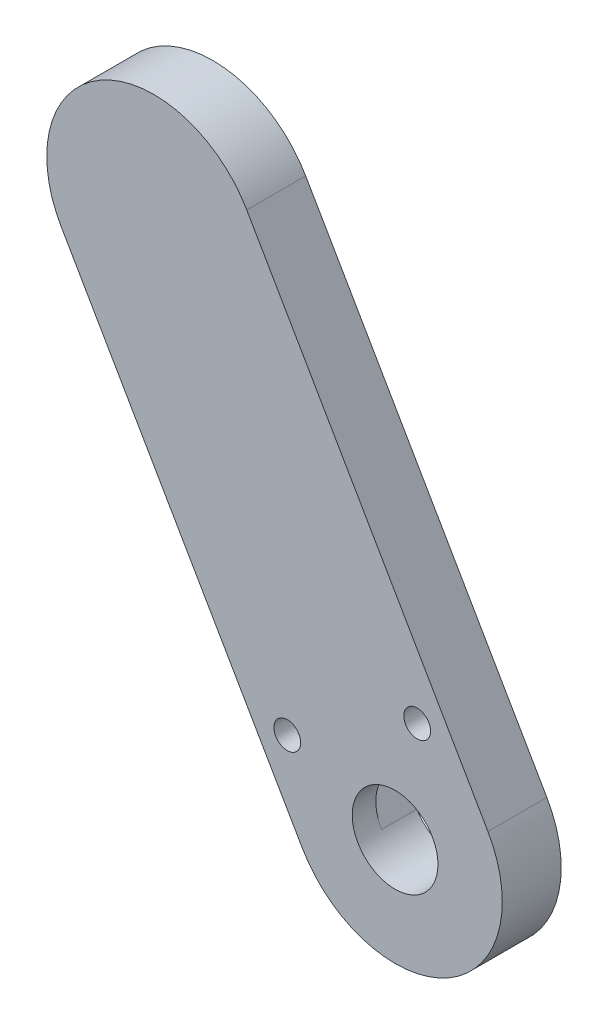
ISO-10303-21;
HEADER;
FILE_DESCRIPTION(('STEP AP214'),'2;1');
FILE_NAME('part.step','',(''),(''),'','','');
FILE_SCHEMA(('AUTOMOTIVE_DESIGN { 1 0 10303 214 1 1 1 1 }'));
ENDSEC;
DATA;
#1=APPLICATION_CONTEXT('core data for automotive mechanical design processes');
#2=APPLICATION_PROTOCOL_DEFINITION('international standard','automotive_design',2000,#1);
#3=PRODUCT_CONTEXT('',#1,'mechanical');
#4=PRODUCT('Part','Part','',(#3));
#5=PRODUCT_RELATED_PRODUCT_CATEGORY('part','',(#4));
#6=PRODUCT_DEFINITION_FORMATION('','',#4);
#7=PRODUCT_DEFINITION_CONTEXT('part definition',#1,'design');
#8=PRODUCT_DEFINITION('design','',#6,#7);
#9=PRODUCT_DEFINITION_SHAPE('','',#8);
#10=(LENGTH_UNIT() NAMED_UNIT(*) SI_UNIT(.MILLI.,.METRE.));
#11=(NAMED_UNIT(*) PLANE_ANGLE_UNIT() SI_UNIT($,.RADIAN.));
#12=(NAMED_UNIT(*) SI_UNIT($,.STERADIAN.) SOLID_ANGLE_UNIT());
#13=UNCERTAINTY_MEASURE_WITH_UNIT(LENGTH_MEASURE(1.E-05),#10,'distance_accuracy_value','');
#14=(GEOMETRIC_REPRESENTATION_CONTEXT(3) GLOBAL_UNCERTAINTY_ASSIGNED_CONTEXT((#13)) GLOBAL_UNIT_ASSIGNED_CONTEXT((#10,
#11,#12)) REPRESENTATION_CONTEXT('',''));
#15=CARTESIAN_POINT('',(0.,0.,0.));
#16=DIRECTION('',(0.,0.,1.));
#17=DIRECTION('',(1.,0.,0.));
#18=AXIS2_PLACEMENT_3D('',#15,#16,#17);
#19=CARTESIAN_POINT('',(3.29089653438087,1.9,2.2));
#20=DIRECTION('',(-0.792019043107697,-0.610496384391233,0.));
#21=DIRECTION('',(0.610496384391233,-0.792019043107697,0.));
#22=AXIS2_PLACEMENT_3D('',#19,#20,#21);
#23=PLANE('',#22);
#24=DIRECTION('',(0.610496384391233,-0.792019043107697,0.));
#25=VECTOR('',#24,1.);
#26=CARTESIAN_POINT('',(-7.98086570489101,16.5232648892552,0.));
#27=LINE('',#26,#25);
#28=CARTESIAN_POINT('',(-1.02070650796357,7.49359859151839,0.));
#29=VERTEX_POINT('',#28);
#30=CARTESIAN_POINT('',(-7.98086570489101,16.5232648892552,-0.00799999999999994));
#31=VERTEX_POINT('',#30);
#32=EDGE_CURVE('E116',#29,#31,#27,.F.);
#33=ORIENTED_EDGE('',*,*,#32,.F.);
#34=DIRECTION('',(0.,0.,1.));
#35=VECTOR('',#34,1.);
#36=CARTESIAN_POINT('',(-1.02070650796357,7.49359859151839,2.2));
#37=LINE('',#36,#35);
#38=CARTESIAN_POINT('',(-1.02070650796356,7.49359859151839,2.2));
#39=VERTEX_POINT('',#38);
#40=EDGE_CURVE('E171',#29,#39,#37,.T.);
#41=ORIENTED_EDGE('',*,*,#40,.T.);
#42=DIRECTION('',(-0.610496384391233,0.792019043107697,0.));
#43=VECTOR('',#42,1.);
#44=CARTESIAN_POINT('',(3.29089653438087,1.9,2.2));
#45=LINE('',#44,#43);
#46=CARTESIAN_POINT('',(-7.98086570489101,16.5232648892552,2.2));
#47=VERTEX_POINT('',#46);
#48=EDGE_CURVE('E200',#39,#47,#45,.T.);
#49=ORIENTED_EDGE('',*,*,#48,.T.);
#50=DIRECTION('',(0.,0.,-1.));
#51=VECTOR('',#50,1.);
#52=CARTESIAN_POINT('',(-7.98086570489101,16.5232648892552,2.2));
#53=LINE('',#52,#51);
#54=EDGE_CURVE('E88',#47,#31,#53,.T.);
#55=ORIENTED_EDGE('',*,*,#54,.T.);
#56=EDGE_LOOP('',(#33,#41,#49,#55));
#57=FACE_BOUND('',#56,.T.);
#58=ADVANCED_FACE('F39',(#57),#23,.T.);
#59=CARTESIAN_POINT('',(-10.319134295109,15.1732648892552,2.2));
#60=DIRECTION('',(0.924714899355206,0.380660419416691,0.));
#61=DIRECTION('',(-0.380660419416691,0.924714899355206,0.));
#62=AXIS2_PLACEMENT_3D('',#59,#60,#61);
#63=PLANE('',#62);
#64=DIRECTION('',(0.380660419416691,-0.924714899355206,0.));
#65=VECTOR('',#64,1.);
#66=CARTESIAN_POINT('',(-10.319134295109,15.1732648892552,2.2));
#67=LINE('',#66,#65);
#68=CARTESIAN_POINT('',(-10.319134295109,15.1732648892552,2.2));
#69=VERTEX_POINT('',#68);
#70=CARTESIAN_POINT('',(-5.97929349203643,4.63075706146375,2.2));
#71=VERTEX_POINT('',#70);
#72=EDGE_CURVE('E258',#69,#71,#67,.T.);
#73=ORIENTED_EDGE('',*,*,#72,.T.);
#74=DIRECTION('',(0.,0.,-1.));
#75=VECTOR('',#74,1.);
#76=CARTESIAN_POINT('',(-5.97929349203643,4.63075706146375,2.2));
#77=LINE('',#76,#75);
#78=CARTESIAN_POINT('',(-5.97929349203643,4.63075706146375,-0.005));
#79=VERTEX_POINT('',#78);
#80=EDGE_CURVE('E168',#71,#79,#77,.T.);
#81=ORIENTED_EDGE('',*,*,#80,.T.);
#82=DIRECTION('',(-0.380660419416691,0.924714899355206,0.));
#83=VECTOR('',#82,1.);
#84=CARTESIAN_POINT('',(-3.29089653438087,-1.9,0.));
#85=LINE('',#84,#83);
#86=CARTESIAN_POINT('',(-10.319134295109,15.1732648892552,-0.008));
#87=VERTEX_POINT('',#86);
#88=EDGE_CURVE('E121',#87,#79,#85,.F.);
#89=ORIENTED_EDGE('',*,*,#88,.F.);
#90=DIRECTION('',(0.,0.,-1.));
#91=VECTOR('',#90,1.);
#92=CARTESIAN_POINT('',(-10.319134295109,15.1732648892552,2.2));
#93=LINE('',#92,#91);
#94=EDGE_CURVE('E254',#69,#87,#93,.T.);
#95=ORIENTED_EDGE('',*,*,#94,.F.);
#96=EDGE_LOOP('',(#73,#81,#89,#95));
#97=FACE_BOUND('',#96,.T.);
#98=ADVANCED_FACE('F220',(#97),#63,.T.);
#99=CARTESIAN_POINT('',(0.,0.,0.));
#100=DIRECTION('',(0.,0.,1.));
#101=DIRECTION('',(1.,0.,0.));
#102=AXIS2_PLACEMENT_3D('',#99,#100,#101);
#103=PLANE('',#102);
#104=CARTESIAN_POINT('',(2.06217782649107,10.4282032302755,0.));
#105=DIRECTION('',(0.,0.,1.));
#106=DIRECTION('',(1.,0.,0.));
#107=AXIS2_PLACEMENT_3D('',#104,#105,#106);
#108=CIRCLE('',#107,1.25);
#109=CARTESIAN_POINT('',(3.31217782649107,10.4282032302755,0.));
#110=VERTEX_POINT('',#109);
#111=EDGE_CURVE('E138',#110,#110,#108,.F.);
#112=ORIENTED_EDGE('',*,*,#111,.F.);
#113=EDGE_LOOP('',(#112));
#114=FACE_BOUND('',#113,.T.);
#115=CARTESIAN_POINT('',(-10.0621778264911,3.42820323027551,0.));
#116=DIRECTION('',(0.,0.,1.));
#117=DIRECTION('',(1.,0.,0.));
#118=AXIS2_PLACEMENT_3D('',#115,#116,#117);
#119=CIRCLE('',#118,1.25);
#120=CARTESIAN_POINT('',(-8.81217782649107,3.42820323027551,0.));
#121=VERTEX_POINT('',#120);
#122=EDGE_CURVE('E133',#121,#121,#119,.F.);
#123=ORIENTED_EDGE('',*,*,#122,.F.);
#124=EDGE_LOOP('',(#123));
#125=FACE_BOUND('',#124,.T.);
#126=CARTESIAN_POINT('',(0.,0.,0.));
#127=DIRECTION('',(0.,0.,1.));
#128=DIRECTION('',(1.,0.,0.));
#129=AXIS2_PLACEMENT_3D('',#126,#127,#128);
#130=CIRCLE('',#129,4.);
#131=CARTESIAN_POINT('',(3.46410161513775,2.,0.));
#132=VERTEX_POINT('',#131);
#133=CARTESIAN_POINT('',(-3.46410161513775,-2.,0.));
#134=VERTEX_POINT('',#133);
#135=EDGE_CURVE('E148',#132,#134,#130,.F.);
#136=ORIENTED_EDGE('',*,*,#135,.F.);
#137=DIRECTION('',(0.5,-0.866025403784439,0.));
#138=VECTOR('',#137,1.);
#139=CARTESIAN_POINT('',(3.46410161513775,2.,0.));
#140=LINE('',#139,#138);
#141=CARTESIAN_POINT('',(-0.0358983848622456,8.06217782649107,0.));
#142=VERTEX_POINT('',#141);
#143=EDGE_CURVE('E47',#142,#132,#140,.T.);
#144=ORIENTED_EDGE('',*,*,#143,.F.);
#145=DIRECTION('',(0.866025403784439,0.5,0.));
#146=VECTOR('',#145,1.);
#147=CARTESIAN_POINT('',(-3.5,6.06217782649107,0.));
#148=LINE('',#147,#146);
#149=EDGE_CURVE('E180',#29,#142,#148,.T.);
#150=ORIENTED_EDGE('',*,*,#149,.F.);
#151=ORIENTED_EDGE('',*,*,#32,.T.);
#152=CARTESIAN_POINT('',(-7.98086570489101,16.5232648892552,0.));
#153=CARTESIAN_POINT('',(-8.26067940745865,17.0079164387563,0.));
#154=CARTESIAN_POINT('',(-8.8005942891116,17.1522647547455,0.));
#155=CARTESIAN_POINT('',(-9.34153350883678,17.29688693145,0.));
#156=CARTESIAN_POINT('',(-9.825,17.0173991843642,0.));
#157=CARTESIAN_POINT('',(-10.3097651123347,16.7371607157452,0.));
#158=CARTESIAN_POINT('',(-10.4539998654902,16.1976706001436,0.));
#159=CARTESIAN_POINT('',(-10.5985086576677,15.657155479539,0.));
#160=CARTESIAN_POINT('',(-10.319134295109,15.1732648892552,0.));
#161=B_SPLINE_CURVE_WITH_KNOTS('',2,(#152,#153,#154,#155,#156,#157,#158,#159,#160),
.UNSPECIFIED.,.F.,.F.,(3,2,2,2,3),(0.,0.25,0.5,0.75,1.),.UNSPECIFIED.);
#162=EDGE_CURVE('E125',#31,#87,#161,.T.);
#163=ORIENTED_EDGE('',*,*,#162,.T.);
#164=ORIENTED_EDGE('',*,*,#88,.T.);
#165=CARTESIAN_POINT('',(-6.96410161513775,4.06217782649107,0.));
#166=VERTEX_POINT('',#165);
#167=EDGE_CURVE('E185',#166,#79,#148,.T.);
#168=ORIENTED_EDGE('',*,*,#167,.F.);
#169=DIRECTION('',(-0.5,0.866025403784439,0.));
#170=VECTOR('',#169,1.);
#171=CARTESIAN_POINT('',(-3.46410161513775,-2.,0.));
#172=LINE('',#171,#170);
#173=EDGE_CURVE('E122',#134,#166,#172,.T.);
#174=ORIENTED_EDGE('',*,*,#173,.F.);
#175=EDGE_LOOP('',(#136,#144,#150,#151,#163,#164,#168,#174));
#176=FACE_BOUND('',#175,.T.);
#177=DIRECTION('',(0.5,-0.866025403784439,0.));
#178=VECTOR('',#177,1.);
#179=CARTESIAN_POINT('',(-31.1602540378444,33.9711431702997,0.));
#180=LINE('',#179,#178);
#181=CARTESIAN_POINT('',(-31.1602540378444,33.9711431702997,0.));
#182=VERTEX_POINT('',#181);
#183=CARTESIAN_POINT('',(-8.66025403784439,-5.,0.));
#184=VERTEX_POINT('',#183);
#185=EDGE_CURVE('E93',#182,#184,#180,.T.);
#186=ORIENTED_EDGE('',*,*,#185,.F.);
#187=CARTESIAN_POINT('',(-22.5,38.9711431702997,0.));
#188=DIRECTION('',(0.,0.,1.));
#189=DIRECTION('',(1.,0.,0.));
#190=AXIS2_PLACEMENT_3D('',#187,#188,#189);
#191=CIRCLE('',#190,10.);
#192=CARTESIAN_POINT('',(-13.8397459621556,43.9711431702997,0.));
#193=VERTEX_POINT('',#192);
#194=EDGE_CURVE('E71',#193,#182,#191,.T.);
#195=ORIENTED_EDGE('',*,*,#194,.F.);
#196=DIRECTION('',(-0.5,0.866025403784439,0.));
#197=VECTOR('',#196,1.);
#198=CARTESIAN_POINT('',(8.66025403784439,5.,0.));
#199=LINE('',#198,#197);
#200=CARTESIAN_POINT('',(8.66025403784439,5.,0.));
#201=VERTEX_POINT('',#200);
#202=EDGE_CURVE('E99',#201,#193,#199,.T.);
#203=ORIENTED_EDGE('',*,*,#202,.F.);
#204=CARTESIAN_POINT('',(0.,0.,0.));
#205=DIRECTION('',(0.,0.,1.));
#206=DIRECTION('',(1.,0.,0.));
#207=AXIS2_PLACEMENT_3D('',#204,#205,#206);
#208=CIRCLE('',#207,10.);
#209=EDGE_CURVE('E98',#184,#201,#208,.T.);
#210=ORIENTED_EDGE('',*,*,#209,.F.);
#211=EDGE_LOOP('',(#186,#195,#203,#210));
#212=FACE_BOUND('',#211,.T.);
#213=ADVANCED_FACE('F96',(#114,#125,#176,#212),#103,.F.);
#214=CARTESIAN_POINT('',(0.,0.,2.2));
#215=DIRECTION('',(0.,0.,1.));
#216=DIRECTION('',(1.,0.,0.));
#217=AXIS2_PLACEMENT_3D('',#214,#215,#216);
#218=PLANE('',#217);
#219=DIRECTION('',(0.866025403784439,0.5,0.));
#220=VECTOR('',#219,1.);
#221=CARTESIAN_POINT('',(-3.5,6.06217782649107,2.2));
#222=LINE('',#221,#220);
#223=EDGE_CURVE('E114',#71,#39,#222,.T.);
#224=ORIENTED_EDGE('',*,*,#223,.F.);
#225=ORIENTED_EDGE('',*,*,#72,.F.);
#226=CARTESIAN_POINT('',(-9.15,15.8482648892552,2.2));
#227=DIRECTION('',(0.,0.,1.));
#228=DIRECTION('',(1.,0.,0.));
#229=AXIS2_PLACEMENT_3D('',#226,#227,#228);
#230=CIRCLE('',#229,1.35);
#231=EDGE_CURVE('E183',#47,#69,#230,.T.);
#232=ORIENTED_EDGE('',*,*,#231,.F.);
#233=ORIENTED_EDGE('',*,*,#48,.F.);
#234=EDGE_LOOP('',(#224,#225,#232,#233));
#235=FACE_BOUND('',#234,.T.);
#236=ADVANCED_FACE('F213',(#235),#218,.F.);
#237=CARTESIAN_POINT('',(8.66025403784439,5.,5.5));
#238=DIRECTION('',(-0.866025403784439,-0.5,0.));
#239=DIRECTION('',(0.5,-0.866025403784439,0.));
#240=AXIS2_PLACEMENT_3D('',#237,#238,#239);
#241=PLANE('',#240);
#242=ORIENTED_EDGE('',*,*,#202,.T.);
#243=DIRECTION('',(0.,0.,-1.));
#244=VECTOR('',#243,1.);
#245=CARTESIAN_POINT('',(-13.8397459621556,43.9711431702997,5.5));
#246=LINE('',#245,#244);
#247=CARTESIAN_POINT('',(-13.8397459621556,43.9711431702997,5.5));
#248=VERTEX_POINT('',#247);
#249=EDGE_CURVE('E84',#248,#193,#246,.T.);
#250=ORIENTED_EDGE('',*,*,#249,.F.);
#251=DIRECTION('',(-0.5,0.866025403784439,0.));
#252=VECTOR('',#251,1.);
#253=CARTESIAN_POINT('',(8.66025403784439,5.,5.5));
#254=LINE('',#253,#252);
#255=CARTESIAN_POINT('',(8.66025403784439,5.,5.5));
#256=VERTEX_POINT('',#255);
#257=EDGE_CURVE('E97',#256,#248,#254,.T.);
#258=ORIENTED_EDGE('',*,*,#257,.F.);
#259=DIRECTION('',(0.,0.,-1.));
#260=VECTOR('',#259,1.);
#261=CARTESIAN_POINT('',(8.66025403784439,5.,5.5));
#262=LINE('',#261,#260);
#263=EDGE_CURVE('E109',#256,#201,#262,.T.);
#264=ORIENTED_EDGE('',*,*,#263,.T.);
#265=EDGE_LOOP('',(#242,#250,#258,#264));
#266=FACE_BOUND('',#265,.T.);
#267=ADVANCED_FACE('F41',(#266),#241,.F.);
#268=CARTESIAN_POINT('',(-31.1602540378444,33.9711431702997,5.5));
#269=DIRECTION('',(0.866025403784439,0.5,0.));
#270=DIRECTION('',(-0.5,0.866025403784439,0.));
#271=AXIS2_PLACEMENT_3D('',#268,#269,#270);
#272=PLANE('',#271);
#273=ORIENTED_EDGE('',*,*,#185,.T.);
#274=DIRECTION('',(0.,0.,-1.));
#275=VECTOR('',#274,1.);
#276=CARTESIAN_POINT('',(-8.66025403784439,-5.,5.5));
#277=LINE('',#276,#275);
#278=CARTESIAN_POINT('',(-8.66025403784439,-5.,5.5));
#279=VERTEX_POINT('',#278);
#280=EDGE_CURVE('E91',#279,#184,#277,.T.);
#281=ORIENTED_EDGE('',*,*,#280,.F.);
#282=DIRECTION('',(0.5,-0.866025403784439,0.));
#283=VECTOR('',#282,1.);
#284=CARTESIAN_POINT('',(-31.1602540378444,33.9711431702997,5.5));
#285=LINE('',#284,#283);
#286=CARTESIAN_POINT('',(-31.1602540378444,33.9711431702997,5.5));
#287=VERTEX_POINT('',#286);
#288=EDGE_CURVE('E59',#287,#279,#285,.T.);
#289=ORIENTED_EDGE('',*,*,#288,.F.);
#290=DIRECTION('',(0.,0.,-1.));
#291=VECTOR('',#290,1.);
#292=CARTESIAN_POINT('',(-31.1602540378444,33.9711431702997,5.5));
#293=LINE('',#292,#291);
#294=EDGE_CURVE('E76',#287,#182,#293,.T.);
#295=ORIENTED_EDGE('',*,*,#294,.T.);
#296=EDGE_LOOP('',(#273,#281,#289,#295));
#297=FACE_BOUND('',#296,.T.);
#298=ADVANCED_FACE('F89',(#297),#272,.F.);
#299=CARTESIAN_POINT('',(0.,0.,5.5));
#300=DIRECTION('',(0.,0.,1.));
#301=DIRECTION('',(1.,0.,0.));
#302=AXIS2_PLACEMENT_3D('',#299,#300,#301);
#303=PLANE('',#302);
#304=CARTESIAN_POINT('',(2.06217782649107,10.4282032302755,5.5));
#305=DIRECTION('',(0.,0.,1.));
#306=DIRECTION('',(1.,0.,0.));
#307=AXIS2_PLACEMENT_3D('',#304,#305,#306);
#308=CIRCLE('',#307,1.25);
#309=CARTESIAN_POINT('',(3.31217782649107,10.4282032302755,5.5));
#310=VERTEX_POINT('',#309);
#311=EDGE_CURVE('E43',#310,#310,#308,.F.);
#312=ORIENTED_EDGE('',*,*,#311,.T.);
#313=EDGE_LOOP('',(#312));
#314=FACE_BOUND('',#313,.T.);
#315=CARTESIAN_POINT('',(-10.0621778264911,3.42820323027551,5.5));
#316=DIRECTION('',(0.,0.,1.));
#317=DIRECTION('',(1.,0.,0.));
#318=AXIS2_PLACEMENT_3D('',#315,#316,#317);
#319=CIRCLE('',#318,1.25);
#320=CARTESIAN_POINT('',(-8.81217782649107,3.42820323027551,5.5));
#321=VERTEX_POINT('',#320);
#322=EDGE_CURVE('E129',#321,#321,#319,.F.);
#323=ORIENTED_EDGE('',*,*,#322,.T.);
#324=EDGE_LOOP('',(#323));
#325=FACE_BOUND('',#324,.T.);
#326=CARTESIAN_POINT('',(0.,0.,5.5));
#327=DIRECTION('',(0.,0.,1.));
#328=DIRECTION('',(1.,0.,0.));
#329=AXIS2_PLACEMENT_3D('',#326,#327,#328);
#330=CIRCLE('',#329,4.);
#331=CARTESIAN_POINT('',(4.,0.,5.5));
#332=VERTEX_POINT('',#331);
#333=EDGE_CURVE('E141',#332,#332,#330,.F.);
#334=ORIENTED_EDGE('',*,*,#333,.T.);
#335=EDGE_LOOP('',(#334));
#336=FACE_BOUND('',#335,.T.);
#337=ORIENTED_EDGE('',*,*,#257,.T.);
#338=CARTESIAN_POINT('',(-22.5,38.9711431702997,5.5));
#339=DIRECTION('',(0.,0.,1.));
#340=DIRECTION('',(1.,0.,0.));
#341=AXIS2_PLACEMENT_3D('',#338,#339,#340);
#342=CIRCLE('',#341,10.);
#343=EDGE_CURVE('E82',#248,#287,#342,.T.);
#344=ORIENTED_EDGE('',*,*,#343,.T.);
#345=ORIENTED_EDGE('',*,*,#288,.T.);
#346=CARTESIAN_POINT('',(0.,0.,5.5));
#347=DIRECTION('',(0.,0.,1.));
#348=DIRECTION('',(1.,0.,0.));
#349=AXIS2_PLACEMENT_3D('',#346,#347,#348);
#350=CIRCLE('',#349,10.);
#351=EDGE_CURVE('E102',#279,#256,#350,.T.);
#352=ORIENTED_EDGE('',*,*,#351,.T.);
#353=EDGE_LOOP('',(#337,#344,#345,#352));
#354=FACE_BOUND('',#353,.T.);
#355=ADVANCED_FACE('F229',(#314,#325,#336,#354),#303,.T.);
#356=CARTESIAN_POINT('',(0.,0.,5.5));
#357=DIRECTION('',(0.,0.,-1.));
#358=DIRECTION('',(-1.,0.,0.));
#359=AXIS2_PLACEMENT_3D('',#356,#357,#358);
#360=CYLINDRICAL_SURFACE('',#359,10.);
#361=ORIENTED_EDGE('',*,*,#209,.T.);
#362=ORIENTED_EDGE('',*,*,#263,.F.);
#363=ORIENTED_EDGE('',*,*,#351,.F.);
#364=ORIENTED_EDGE('',*,*,#280,.T.);
#365=EDGE_LOOP('',(#361,#362,#363,#364));
#366=FACE_BOUND('',#365,.T.);
#367=ADVANCED_FACE('F228',(#366),#360,.T.);
#368=CARTESIAN_POINT('',(-22.5,38.9711431702997,5.5));
#369=DIRECTION('',(0.,0.,-1.));
#370=DIRECTION('',(-1.,0.,0.));
#371=AXIS2_PLACEMENT_3D('',#368,#369,#370);
#372=CYLINDRICAL_SURFACE('',#371,10.);
#373=ORIENTED_EDGE('',*,*,#343,.F.);
#374=ORIENTED_EDGE('',*,*,#249,.T.);
#375=ORIENTED_EDGE('',*,*,#194,.T.);
#376=ORIENTED_EDGE('',*,*,#294,.F.);
#377=EDGE_LOOP('',(#373,#374,#375,#376));
#378=FACE_BOUND('',#377,.T.);
#379=ADVANCED_FACE('F78',(#378),#372,.T.);
#380=CARTESIAN_POINT('',(-9.15,15.8482648892552,2.2));
#381=DIRECTION('',(0.,0.,-1.));
#382=DIRECTION('',(-1.,0.,0.));
#383=AXIS2_PLACEMENT_3D('',#380,#381,#382);
#384=CYLINDRICAL_SURFACE('',#383,1.35);
#385=ORIENTED_EDGE('',*,*,#162,.F.);
#386=ORIENTED_EDGE('',*,*,#54,.F.);
#387=ORIENTED_EDGE('',*,*,#231,.T.);
#388=ORIENTED_EDGE('',*,*,#94,.T.);
#389=EDGE_LOOP('',(#385,#386,#387,#388));
#390=FACE_BOUND('',#389,.T.);
#391=ADVANCED_FACE('F203',(#390),#384,.F.);
#392=CARTESIAN_POINT('',(3.46410161513775,2.,3.3));
#393=DIRECTION('',(-0.866025403784439,-0.5,0.));
#394=DIRECTION('',(0.5,-0.866025403784439,0.));
#395=AXIS2_PLACEMENT_3D('',#392,#393,#394);
#396=PLANE('',#395);
#397=ORIENTED_EDGE('',*,*,#143,.T.);
#398=DIRECTION('',(0.,0.,-1.));
#399=VECTOR('',#398,1.);
#400=CARTESIAN_POINT('',(3.46410161513775,2.,3.3));
#401=LINE('',#400,#399);
#402=CARTESIAN_POINT('',(3.46410161513775,2.,3.3));
#403=VERTEX_POINT('',#402);
#404=EDGE_CURVE('E170',#403,#132,#401,.T.);
#405=ORIENTED_EDGE('',*,*,#404,.F.);
#406=DIRECTION('',(-0.5,0.866025403784439,0.));
#407=VECTOR('',#406,1.);
#408=CARTESIAN_POINT('',(3.46410161513775,2.,3.3));
#409=LINE('',#408,#407);
#410=CARTESIAN_POINT('',(-0.0358983848622456,8.06217782649107,3.3));
#411=VERTEX_POINT('',#410);
#412=EDGE_CURVE('E149',#403,#411,#409,.T.);
#413=ORIENTED_EDGE('',*,*,#412,.T.);
#414=DIRECTION('',(0.,0.,-1.));
#415=VECTOR('',#414,1.);
#416=CARTESIAN_POINT('',(-0.0358983848622456,8.06217782649107,3.3));
#417=LINE('',#416,#415);
#418=EDGE_CURVE('E163',#411,#142,#417,.T.);
#419=ORIENTED_EDGE('',*,*,#418,.T.);
#420=EDGE_LOOP('',(#397,#405,#413,#419));
#421=FACE_BOUND('',#420,.T.);
#422=ADVANCED_FACE('F211',(#421),#396,.T.);
#423=CARTESIAN_POINT('',(-6.96410161513775,4.06217782649107,3.3));
#424=DIRECTION('',(0.866025403784439,0.5,0.));
#425=DIRECTION('',(-0.5,0.866025403784439,0.));
#426=AXIS2_PLACEMENT_3D('',#423,#424,#425);
#427=PLANE('',#426);
#428=ORIENTED_EDGE('',*,*,#173,.T.);
#429=DIRECTION('',(0.,0.,-1.));
#430=VECTOR('',#429,1.);
#431=CARTESIAN_POINT('',(-6.96410161513775,4.06217782649107,3.3));
#432=LINE('',#431,#430);
#433=CARTESIAN_POINT('',(-6.96410161513775,4.06217782649107,3.3));
#434=VERTEX_POINT('',#433);
#435=EDGE_CURVE('E161',#434,#166,#432,.T.);
#436=ORIENTED_EDGE('',*,*,#435,.F.);
#437=DIRECTION('',(0.5,-0.866025403784439,0.));
#438=VECTOR('',#437,1.);
#439=CARTESIAN_POINT('',(-6.96410161513775,4.06217782649107,3.3));
#440=LINE('',#439,#438);
#441=CARTESIAN_POINT('',(-3.46410161513775,-2.,3.3));
#442=VERTEX_POINT('',#441);
#443=EDGE_CURVE('E154',#434,#442,#440,.T.);
#444=ORIENTED_EDGE('',*,*,#443,.T.);
#445=DIRECTION('',(0.,0.,-1.));
#446=VECTOR('',#445,1.);
#447=CARTESIAN_POINT('',(-3.46410161513775,-2.,3.3));
#448=LINE('',#447,#446);
#449=EDGE_CURVE('E158',#442,#134,#448,.T.);
#450=ORIENTED_EDGE('',*,*,#449,.T.);
#451=EDGE_LOOP('',(#428,#436,#444,#450));
#452=FACE_BOUND('',#451,.T.);
#453=ADVANCED_FACE('F325',(#452),#427,.T.);
#454=CARTESIAN_POINT('',(-0.0358983848622456,8.06217782649107,3.3));
#455=DIRECTION('',(0.5,-0.866025403784439,0.));
#456=DIRECTION('',(0.866025403784439,0.5,0.));
#457=AXIS2_PLACEMENT_3D('',#454,#455,#456);
#458=PLANE('',#457);
#459=ORIENTED_EDGE('',*,*,#167,.T.);
#460=ORIENTED_EDGE('',*,*,#80,.F.);
#461=ORIENTED_EDGE('',*,*,#223,.T.);
#462=ORIENTED_EDGE('',*,*,#40,.F.);
#463=ORIENTED_EDGE('',*,*,#149,.T.);
#464=ORIENTED_EDGE('',*,*,#418,.F.);
#465=DIRECTION('',(-0.866025403784439,-0.5,0.));
#466=VECTOR('',#465,1.);
#467=CARTESIAN_POINT('',(-0.0358983848622456,8.06217782649107,3.3));
#468=LINE('',#467,#466);
#469=EDGE_CURVE('E155',#411,#434,#468,.T.);
#470=ORIENTED_EDGE('',*,*,#469,.T.);
#471=ORIENTED_EDGE('',*,*,#435,.T.);
#472=EDGE_LOOP('',(#459,#460,#461,#462,#463,#464,#470,#471));
#473=FACE_BOUND('',#472,.T.);
#474=ADVANCED_FACE('F324',(#473),#458,.T.);
#475=CARTESIAN_POINT('',(0.,0.,3.3));
#476=DIRECTION('',(0.,0.,1.));
#477=DIRECTION('',(1.,0.,0.));
#478=AXIS2_PLACEMENT_3D('',#475,#476,#477);
#479=PLANE('',#478);
#480=CARTESIAN_POINT('',(0.,0.,3.3));
#481=DIRECTION('',(0.,0.,1.));
#482=DIRECTION('',(1.,0.,0.));
#483=AXIS2_PLACEMENT_3D('',#480,#481,#482);
#484=CIRCLE('',#483,4.);
#485=EDGE_CURVE('E11',#442,#403,#484,.F.);
#486=ORIENTED_EDGE('',*,*,#485,.F.);
#487=ORIENTED_EDGE('',*,*,#443,.F.);
#488=ORIENTED_EDGE('',*,*,#469,.F.);
#489=ORIENTED_EDGE('',*,*,#412,.F.);
#490=EDGE_LOOP('',(#486,#487,#488,#489));
#491=FACE_BOUND('',#490,.T.);
#492=ADVANCED_FACE('F311',(#491),#479,.F.);
#493=CARTESIAN_POINT('',(0.,0.,5.6));
#494=DIRECTION('',(0.,0.,-1.));
#495=DIRECTION('',(-1.,0.,0.));
#496=AXIS2_PLACEMENT_3D('',#493,#494,#495);
#497=CYLINDRICAL_SURFACE('',#496,4.);
#498=ORIENTED_EDGE('',*,*,#333,.F.);
#499=EDGE_LOOP('',(#498));
#500=FACE_BOUND('',#499,.T.);
#501=ORIENTED_EDGE('',*,*,#135,.T.);
#502=ORIENTED_EDGE('',*,*,#449,.F.);
#503=ORIENTED_EDGE('',*,*,#485,.T.);
#504=ORIENTED_EDGE('',*,*,#404,.T.);
#505=EDGE_LOOP('',(#501,#502,#503,#504));
#506=FACE_BOUND('',#505,.T.);
#507=ADVANCED_FACE('F307',(#500,#506),#497,.F.);
#508=CARTESIAN_POINT('',(-10.0621778264911,3.42820323027551,5.6));
#509=DIRECTION('',(0.,0.,-1.));
#510=DIRECTION('',(-1.,0.,0.));
#511=AXIS2_PLACEMENT_3D('',#508,#509,#510);
#512=CYLINDRICAL_SURFACE('',#511,1.25);
#513=ORIENTED_EDGE('',*,*,#322,.F.);
#514=EDGE_LOOP('',(#513));
#515=FACE_BOUND('',#514,.T.);
#516=ORIENTED_EDGE('',*,*,#122,.T.);
#517=EDGE_LOOP('',(#516));
#518=FACE_BOUND('',#517,.T.);
#519=ADVANCED_FACE('F337',(#515,#518),#512,.F.);
#520=CARTESIAN_POINT('',(2.06217782649107,10.4282032302755,5.6));
#521=DIRECTION('',(0.,0.,-1.));
#522=DIRECTION('',(-1.,0.,0.));
#523=AXIS2_PLACEMENT_3D('',#520,#521,#522);
#524=CYLINDRICAL_SURFACE('',#523,1.25);
#525=ORIENTED_EDGE('',*,*,#311,.F.);
#526=EDGE_LOOP('',(#525));
#527=FACE_BOUND('',#526,.T.);
#528=ORIENTED_EDGE('',*,*,#111,.T.);
#529=EDGE_LOOP('',(#528));
#530=FACE_BOUND('',#529,.T.);
#531=ADVANCED_FACE('F343',(#527,#530),#524,.F.);
#532=CLOSED_SHELL('',(#58,#98,#213,#236,#267,#298,#355,#367,#379,#391,#422,#453,#474,#492,#507,
#519,#531));
#533=MANIFOLD_SOLID_BREP('B2',#532);
#534=ADVANCED_BREP_SHAPE_REPRESENTATION('',(#18,#533),#14);
#535=SHAPE_DEFINITION_REPRESENTATION(#9,#534);
ENDSEC;
END-ISO-10303-21;
